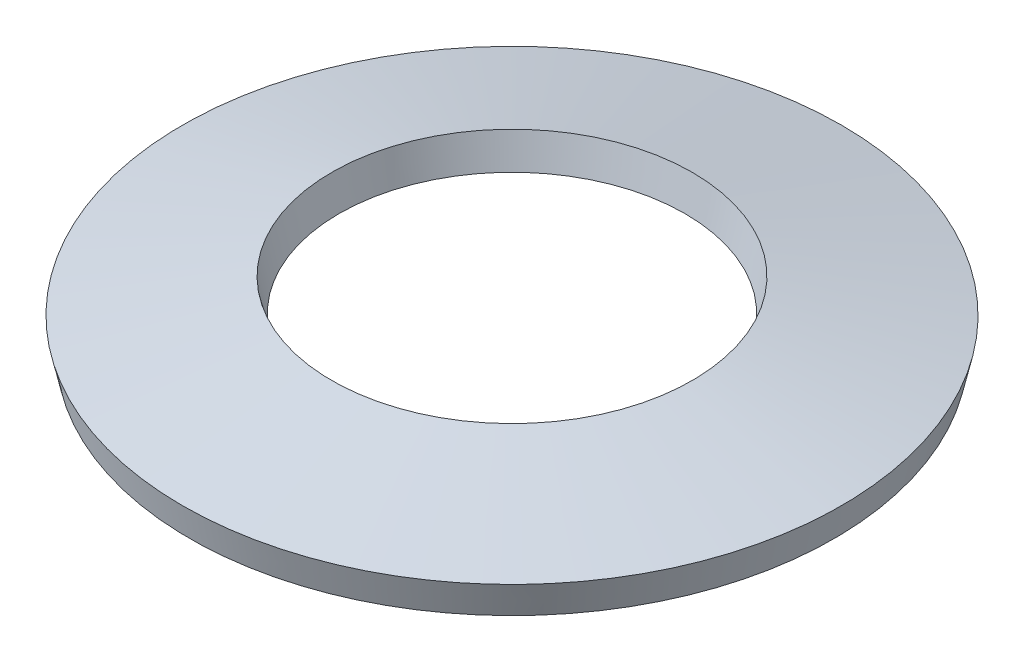
ISO-10303-21;
HEADER;
FILE_DESCRIPTION(('STEP AP214'),'2;1');
FILE_NAME('part.step','',(''),(''),'','','');
FILE_SCHEMA(('AUTOMOTIVE_DESIGN { 1 0 10303 214 1 1 1 1 }'));
ENDSEC;
DATA;
#1=APPLICATION_CONTEXT('core data for automotive mechanical design processes');
#2=APPLICATION_PROTOCOL_DEFINITION('international standard','automotive_design',2000,#1);
#3=PRODUCT_CONTEXT('',#1,'mechanical');
#4=PRODUCT('Part','Part','',(#3));
#5=PRODUCT_RELATED_PRODUCT_CATEGORY('part','',(#4));
#6=PRODUCT_DEFINITION_FORMATION('','',#4);
#7=PRODUCT_DEFINITION_CONTEXT('part definition',#1,'design');
#8=PRODUCT_DEFINITION('design','',#6,#7);
#9=PRODUCT_DEFINITION_SHAPE('','',#8);
#10=(LENGTH_UNIT() NAMED_UNIT(*) SI_UNIT(.MILLI.,.METRE.));
#11=(NAMED_UNIT(*) PLANE_ANGLE_UNIT() SI_UNIT($,.RADIAN.));
#12=(NAMED_UNIT(*) SI_UNIT($,.STERADIAN.) SOLID_ANGLE_UNIT());
#13=UNCERTAINTY_MEASURE_WITH_UNIT(LENGTH_MEASURE(1.E-05),#10,'distance_accuracy_value','');
#14=(GEOMETRIC_REPRESENTATION_CONTEXT(3) GLOBAL_UNCERTAINTY_ASSIGNED_CONTEXT((#13)) GLOBAL_UNIT_ASSIGNED_CONTEXT((#10,
#11,#12)) REPRESENTATION_CONTEXT('',''));
#15=CARTESIAN_POINT('',(0.,0.,0.));
#16=DIRECTION('',(0.,0.,1.));
#17=DIRECTION('',(1.,0.,0.));
#18=AXIS2_PLACEMENT_3D('',#15,#16,#17);
#19=CARTESIAN_POINT('',(0.,0.,0.));
#20=DIRECTION('',(0.,1.,0.));
#21=DIRECTION('',(0.,0.,1.));
#22=AXIS2_PLACEMENT_3D('',#19,#20,#21);
#23=CONICAL_SURFACE('',#22,3.91174079164807,0.222478816536513);
#24=CARTESIAN_POINT('',(0.,0.39014140018856,0.));
#25=DIRECTION('',(0.,-1.,0.));
#26=DIRECTION('',(0.,0.,-1.));
#27=AXIS2_PLACEMENT_3D('',#24,#25,#26);
#28=CIRCLE('',#27,4.);
#29=CARTESIAN_POINT('',(0.,0.39014140018856,-4.));
#30=VERTEX_POINT('',#29);
#31=EDGE_CURVE('E10',#30,#30,#28,.T.);
#32=ORIENTED_EDGE('',*,*,#31,.T.);
#33=EDGE_LOOP('',(#32));
#34=FACE_BOUND('',#33,.T.);
#35=CARTESIAN_POINT('',(0.,0.,0.));
#36=DIRECTION('',(0.,-1.,0.));
#37=DIRECTION('',(0.,0.,-1.));
#38=AXIS2_PLACEMENT_3D('',#35,#36,#37);
#39=CIRCLE('',#38,3.91174079164807);
#40=CARTESIAN_POINT('',(0.,0.,-3.91174079164807));
#41=VERTEX_POINT('',#40);
#42=EDGE_CURVE('E48',#41,#41,#39,.T.);
#43=ORIENTED_EDGE('',*,*,#42,.F.);
#44=EDGE_LOOP('',(#43));
#45=FACE_BOUND('',#44,.T.);
#46=ADVANCED_FACE('F34',(#34,#45),#23,.T.);
#47=CARTESIAN_POINT('',(0.,0.39014140018856,0.));
#48=DIRECTION('',(0.,-1.,0.));
#49=DIRECTION('',(0.,0.,-1.));
#50=AXIS2_PLACEMENT_3D('',#47,#48,#49);
#51=CONICAL_SURFACE('',#50,4.,1.34831751025838);
#52=CARTESIAN_POINT('',(0.,0.8,0.));
#53=DIRECTION('',(0.,-1.,0.));
#54=DIRECTION('',(0.,0.,-1.));
#55=AXIS2_PLACEMENT_3D('',#52,#53,#54);
#56=CIRCLE('',#55,2.18825920835193);
#57=CARTESIAN_POINT('',(0.,0.8,-2.18825920835193));
#58=VERTEX_POINT('',#57);
#59=EDGE_CURVE('E40',#58,#58,#56,.T.);
#60=ORIENTED_EDGE('',*,*,#59,.T.);
#61=EDGE_LOOP('',(#60));
#62=FACE_BOUND('',#61,.T.);
#63=ORIENTED_EDGE('',*,*,#31,.F.);
#64=EDGE_LOOP('',(#63));
#65=FACE_BOUND('',#64,.T.);
#66=ADVANCED_FACE('F58',(#62,#65),#51,.T.);
#67=CARTESIAN_POINT('',(0.,0.8,0.));
#68=DIRECTION('',(0.,1.,0.));
#69=DIRECTION('',(0.,0.,1.));
#70=AXIS2_PLACEMENT_3D('',#67,#68,#69);
#71=CONICAL_SURFACE('',#70,2.18825920835193,0.222478816536514);
#72=CARTESIAN_POINT('',(0.,0.40985859981144,0.));
#73=DIRECTION('',(0.,-1.,0.));
#74=DIRECTION('',(0.,0.,-1.));
#75=AXIS2_PLACEMENT_3D('',#72,#73,#74);
#76=CIRCLE('',#75,2.1);
#77=CARTESIAN_POINT('',(0.,0.40985859981144,-2.1));
#78=VERTEX_POINT('',#77);
#79=EDGE_CURVE('E44',#78,#78,#76,.T.);
#80=ORIENTED_EDGE('',*,*,#79,.T.);
#81=EDGE_LOOP('',(#80));
#82=FACE_BOUND('',#81,.T.);
#83=ORIENTED_EDGE('',*,*,#59,.F.);
#84=EDGE_LOOP('',(#83));
#85=FACE_BOUND('',#84,.T.);
#86=ADVANCED_FACE('F62',(#82,#85),#71,.F.);
#87=CARTESIAN_POINT('',(0.,0.40985859981144,0.));
#88=DIRECTION('',(0.,-1.,0.));
#89=DIRECTION('',(0.,0.,-1.));
#90=AXIS2_PLACEMENT_3D('',#87,#88,#89);
#91=CONICAL_SURFACE('',#90,2.1,1.34831751025838);
#92=ORIENTED_EDGE('',*,*,#42,.T.);
#93=EDGE_LOOP('',(#92));
#94=FACE_BOUND('',#93,.T.);
#95=ORIENTED_EDGE('',*,*,#79,.F.);
#96=EDGE_LOOP('',(#95));
#97=FACE_BOUND('',#96,.T.);
#98=ADVANCED_FACE('F54',(#94,#97),#91,.F.);
#99=CLOSED_SHELL('',(#46,#66,#86,#98));
#100=MANIFOLD_SOLID_BREP('B2',#99);
#101=ADVANCED_BREP_SHAPE_REPRESENTATION('',(#18,#100),#14);
#102=SHAPE_DEFINITION_REPRESENTATION(#9,#101);
ENDSEC;
END-ISO-10303-21;
